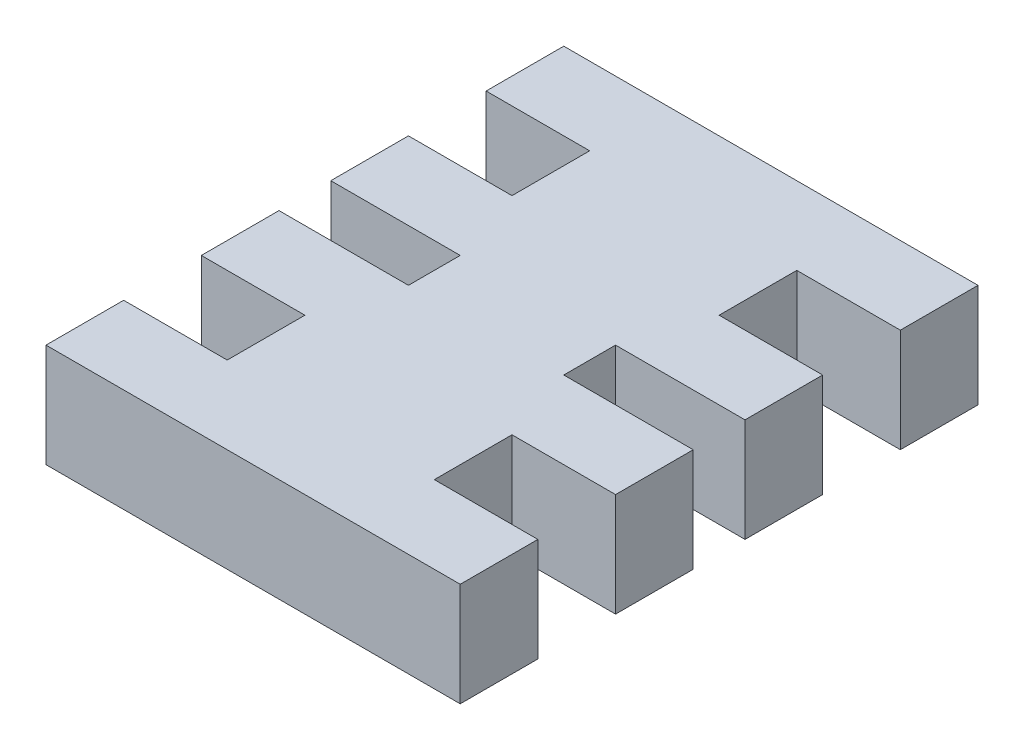
ISO-10303-21;
HEADER;
FILE_DESCRIPTION(('STEP AP214'),'2;1');
FILE_NAME('part.step','',(''),(''),'','','');
FILE_SCHEMA(('AUTOMOTIVE_DESIGN { 1 0 10303 214 1 1 1 1 }'));
ENDSEC;
DATA;
#1=APPLICATION_CONTEXT('core data for automotive mechanical design processes');
#2=APPLICATION_PROTOCOL_DEFINITION('international standard','automotive_design',2000,#1);
#3=PRODUCT_CONTEXT('',#1,'mechanical');
#4=PRODUCT('Part','Part','',(#3));
#5=PRODUCT_RELATED_PRODUCT_CATEGORY('part','',(#4));
#6=PRODUCT_DEFINITION_FORMATION('','',#4);
#7=PRODUCT_DEFINITION_CONTEXT('part definition',#1,'design');
#8=PRODUCT_DEFINITION('design','',#6,#7);
#9=PRODUCT_DEFINITION_SHAPE('','',#8);
#10=(LENGTH_UNIT() NAMED_UNIT(*) SI_UNIT(.MILLI.,.METRE.));
#11=(NAMED_UNIT(*) PLANE_ANGLE_UNIT() SI_UNIT($,.RADIAN.));
#12=(NAMED_UNIT(*) SI_UNIT($,.STERADIAN.) SOLID_ANGLE_UNIT());
#13=UNCERTAINTY_MEASURE_WITH_UNIT(LENGTH_MEASURE(1.E-05),#10,'distance_accuracy_value','');
#14=(GEOMETRIC_REPRESENTATION_CONTEXT(3) GLOBAL_UNCERTAINTY_ASSIGNED_CONTEXT((#13)) GLOBAL_UNIT_ASSIGNED_CONTEXT((#10,
#11,#12)) REPRESENTATION_CONTEXT('',''));
#15=CARTESIAN_POINT('',(0.,0.,0.));
#16=DIRECTION('',(0.,0.,1.));
#17=DIRECTION('',(1.,0.,0.));
#18=AXIS2_PLACEMENT_3D('',#15,#16,#17);
#19=CARTESIAN_POINT('',(40.,20.,-50.));
#20=DIRECTION('',(1.,0.,0.));
#21=DIRECTION('',(0.,0.,-1.));
#22=AXIS2_PLACEMENT_3D('',#19,#20,#21);
#23=PLANE('',#22);
#24=DIRECTION('',(0.,0.,1.));
#25=VECTOR('',#24,1.);
#26=CARTESIAN_POINT('',(40.,0.,-50.));
#27=LINE('',#26,#25);
#28=CARTESIAN_POINT('',(40.,0.,-50.));
#29=VERTEX_POINT('',#28);
#30=CARTESIAN_POINT('',(40.,0.,-35.));
#31=VERTEX_POINT('',#30);
#32=EDGE_CURVE('E251',#29,#31,#27,.T.);
#33=ORIENTED_EDGE('',*,*,#32,.F.);
#34=DIRECTION('',(0.,-1.,0.));
#35=VECTOR('',#34,1.);
#36=CARTESIAN_POINT('',(40.,20.,-50.));
#37=LINE('',#36,#35);
#38=CARTESIAN_POINT('',(40.,20.,-50.));
#39=VERTEX_POINT('',#38);
#40=EDGE_CURVE('E11',#39,#29,#37,.T.);
#41=ORIENTED_EDGE('',*,*,#40,.F.);
#42=DIRECTION('',(0.,0.,1.));
#43=VECTOR('',#42,1.);
#44=CARTESIAN_POINT('',(40.,20.,-50.));
#45=LINE('',#44,#43);
#46=CARTESIAN_POINT('',(40.,20.,-35.));
#47=VERTEX_POINT('',#46);
#48=EDGE_CURVE('E320',#39,#47,#45,.T.);
#49=ORIENTED_EDGE('',*,*,#48,.T.);
#50=DIRECTION('',(0.,-1.,0.));
#51=VECTOR('',#50,1.);
#52=CARTESIAN_POINT('',(40.,20.,-35.));
#53=LINE('',#52,#51);
#54=EDGE_CURVE('E36',#47,#31,#53,.T.);
#55=ORIENTED_EDGE('',*,*,#54,.T.);
#56=EDGE_LOOP('',(#33,#41,#49,#55));
#57=FACE_BOUND('',#56,.T.);
#58=ADVANCED_FACE('F33',(#57),#23,.T.);
#59=CARTESIAN_POINT('',(40.,20.,-50.));
#60=DIRECTION('',(0.,0.,1.));
#61=DIRECTION('',(1.,0.,0.));
#62=AXIS2_PLACEMENT_3D('',#59,#60,#61);
#63=PLANE('',#62);
#64=DIRECTION('',(-1.,0.,0.));
#65=VECTOR('',#64,1.);
#66=CARTESIAN_POINT('',(40.,0.,-50.));
#67=LINE('',#66,#65);
#68=CARTESIAN_POINT('',(-40.,0.,-50.));
#69=VERTEX_POINT('',#68);
#70=EDGE_CURVE('E138',#29,#69,#67,.T.);
#71=ORIENTED_EDGE('',*,*,#70,.T.);
#72=DIRECTION('',(0.,-1.,0.));
#73=VECTOR('',#72,1.);
#74=CARTESIAN_POINT('',(-40.,20.,-50.));
#75=LINE('',#74,#73);
#76=CARTESIAN_POINT('',(-40.,20.,-50.));
#77=VERTEX_POINT('',#76);
#78=EDGE_CURVE('E42',#77,#69,#75,.T.);
#79=ORIENTED_EDGE('',*,*,#78,.F.);
#80=DIRECTION('',(-1.,0.,0.));
#81=VECTOR('',#80,1.);
#82=CARTESIAN_POINT('',(40.,20.,-50.));
#83=LINE('',#82,#81);
#84=EDGE_CURVE('E229',#39,#77,#83,.T.);
#85=ORIENTED_EDGE('',*,*,#84,.F.);
#86=ORIENTED_EDGE('',*,*,#40,.T.);
#87=EDGE_LOOP('',(#71,#79,#85,#86));
#88=FACE_BOUND('',#87,.T.);
#89=ADVANCED_FACE('F548',(#88),#63,.F.);
#90=CARTESIAN_POINT('',(-40.,20.,-50.));
#91=DIRECTION('',(1.,0.,0.));
#92=DIRECTION('',(0.,0.,-1.));
#93=AXIS2_PLACEMENT_3D('',#90,#91,#92);
#94=PLANE('',#93);
#95=DIRECTION('',(0.,0.,1.));
#96=VECTOR('',#95,1.);
#97=CARTESIAN_POINT('',(-40.,0.,-50.));
#98=LINE('',#97,#96);
#99=CARTESIAN_POINT('',(-40.,0.,-35.));
#100=VERTEX_POINT('',#99);
#101=EDGE_CURVE('E236',#69,#100,#98,.T.);
#102=ORIENTED_EDGE('',*,*,#101,.T.);
#103=DIRECTION('',(0.,-1.,0.));
#104=VECTOR('',#103,1.);
#105=CARTESIAN_POINT('',(-40.,20.,-35.));
#106=LINE('',#105,#104);
#107=CARTESIAN_POINT('',(-40.,20.,-35.));
#108=VERTEX_POINT('',#107);
#109=EDGE_CURVE('E233',#108,#100,#106,.T.);
#110=ORIENTED_EDGE('',*,*,#109,.F.);
#111=DIRECTION('',(0.,0.,1.));
#112=VECTOR('',#111,1.);
#113=CARTESIAN_POINT('',(-40.,20.,-50.));
#114=LINE('',#113,#112);
#115=EDGE_CURVE('E222',#77,#108,#114,.T.);
#116=ORIENTED_EDGE('',*,*,#115,.F.);
#117=ORIENTED_EDGE('',*,*,#78,.T.);
#118=EDGE_LOOP('',(#102,#110,#116,#117));
#119=FACE_BOUND('',#118,.T.);
#120=ADVANCED_FACE('F234',(#119),#94,.F.);
#121=CARTESIAN_POINT('',(-40.,20.,-35.));
#122=DIRECTION('',(0.,0.,-1.));
#123=DIRECTION('',(-1.,0.,0.));
#124=AXIS2_PLACEMENT_3D('',#121,#122,#123);
#125=PLANE('',#124);
#126=DIRECTION('',(1.,0.,0.));
#127=VECTOR('',#126,1.);
#128=CARTESIAN_POINT('',(-40.,0.,-35.));
#129=LINE('',#128,#127);
#130=CARTESIAN_POINT('',(-20.,0.,-35.));
#131=VERTEX_POINT('',#130);
#132=EDGE_CURVE('E317',#100,#131,#129,.T.);
#133=ORIENTED_EDGE('',*,*,#132,.T.);
#134=DIRECTION('',(0.,-1.,0.));
#135=VECTOR('',#134,1.);
#136=CARTESIAN_POINT('',(-20.,20.,-35.));
#137=LINE('',#136,#135);
#138=CARTESIAN_POINT('',(-20.,20.,-35.));
#139=VERTEX_POINT('',#138);
#140=EDGE_CURVE('E239',#139,#131,#137,.T.);
#141=ORIENTED_EDGE('',*,*,#140,.F.);
#142=DIRECTION('',(1.,0.,0.));
#143=VECTOR('',#142,1.);
#144=CARTESIAN_POINT('',(-40.,20.,-35.));
#145=LINE('',#144,#143);
#146=EDGE_CURVE('E227',#108,#139,#145,.T.);
#147=ORIENTED_EDGE('',*,*,#146,.F.);
#148=ORIENTED_EDGE('',*,*,#109,.T.);
#149=EDGE_LOOP('',(#133,#141,#147,#148));
#150=FACE_BOUND('',#149,.T.);
#151=ADVANCED_FACE('F241',(#150),#125,.F.);
#152=CARTESIAN_POINT('',(-20.,20.,-35.));
#153=DIRECTION('',(1.,0.,0.));
#154=DIRECTION('',(0.,0.,-1.));
#155=AXIS2_PLACEMENT_3D('',#152,#153,#154);
#156=PLANE('',#155);
#157=DIRECTION('',(0.,0.,1.));
#158=VECTOR('',#157,1.);
#159=CARTESIAN_POINT('',(-20.,0.,-35.));
#160=LINE('',#159,#158);
#161=CARTESIAN_POINT('',(-20.,0.,-20.));
#162=VERTEX_POINT('',#161);
#163=EDGE_CURVE('E315',#131,#162,#160,.T.);
#164=ORIENTED_EDGE('',*,*,#163,.T.);
#165=DIRECTION('',(0.,-1.,0.));
#166=VECTOR('',#165,1.);
#167=CARTESIAN_POINT('',(-20.,20.,-20.));
#168=LINE('',#167,#166);
#169=CARTESIAN_POINT('',(-20.,20.,-20.));
#170=VERTEX_POINT('',#169);
#171=EDGE_CURVE('E324',#170,#162,#168,.T.);
#172=ORIENTED_EDGE('',*,*,#171,.F.);
#173=DIRECTION('',(0.,0.,1.));
#174=VECTOR('',#173,1.);
#175=CARTESIAN_POINT('',(-20.,20.,-35.));
#176=LINE('',#175,#174);
#177=EDGE_CURVE('E244',#139,#170,#176,.T.);
#178=ORIENTED_EDGE('',*,*,#177,.F.);
#179=ORIENTED_EDGE('',*,*,#140,.T.);
#180=EDGE_LOOP('',(#164,#172,#178,#179));
#181=FACE_BOUND('',#180,.T.);
#182=ADVANCED_FACE('F384',(#181),#156,.F.);
#183=CARTESIAN_POINT('',(-20.,20.,-20.));
#184=DIRECTION('',(0.,0.,1.));
#185=DIRECTION('',(1.,0.,0.));
#186=AXIS2_PLACEMENT_3D('',#183,#184,#185);
#187=PLANE('',#186);
#188=DIRECTION('',(-1.,0.,0.));
#189=VECTOR('',#188,1.);
#190=CARTESIAN_POINT('',(-20.,0.,-20.));
#191=LINE('',#190,#189);
#192=CARTESIAN_POINT('',(-40.,0.,-20.));
#193=VERTEX_POINT('',#192);
#194=EDGE_CURVE('E313',#162,#193,#191,.T.);
#195=ORIENTED_EDGE('',*,*,#194,.T.);
#196=DIRECTION('',(0.,-1.,0.));
#197=VECTOR('',#196,1.);
#198=CARTESIAN_POINT('',(-40.,20.,-20.));
#199=LINE('',#198,#197);
#200=CARTESIAN_POINT('',(-40.,20.,-20.));
#201=VERTEX_POINT('',#200);
#202=EDGE_CURVE('E327',#201,#193,#199,.T.);
#203=ORIENTED_EDGE('',*,*,#202,.F.);
#204=DIRECTION('',(-1.,0.,0.));
#205=VECTOR('',#204,1.);
#206=CARTESIAN_POINT('',(-20.,20.,-20.));
#207=LINE('',#206,#205);
#208=EDGE_CURVE('E246',#170,#201,#207,.T.);
#209=ORIENTED_EDGE('',*,*,#208,.F.);
#210=ORIENTED_EDGE('',*,*,#171,.T.);
#211=EDGE_LOOP('',(#195,#203,#209,#210));
#212=FACE_BOUND('',#211,.T.);
#213=ADVANCED_FACE('F392',(#212),#187,.F.);
#214=CARTESIAN_POINT('',(-40.,20.,-20.));
#215=DIRECTION('',(1.,0.,0.));
#216=DIRECTION('',(0.,0.,-1.));
#217=AXIS2_PLACEMENT_3D('',#214,#215,#216);
#218=PLANE('',#217);
#219=DIRECTION('',(0.,0.,1.));
#220=VECTOR('',#219,1.);
#221=CARTESIAN_POINT('',(-40.,0.,-20.));
#222=LINE('',#221,#220);
#223=CARTESIAN_POINT('',(-40.,0.,-4.99999999999999));
#224=VERTEX_POINT('',#223);
#225=EDGE_CURVE('E311',#193,#224,#222,.T.);
#226=ORIENTED_EDGE('',*,*,#225,.T.);
#227=DIRECTION('',(0.,-1.,0.));
#228=VECTOR('',#227,1.);
#229=CARTESIAN_POINT('',(-40.,20.,-4.99999999999999));
#230=LINE('',#229,#228);
#231=CARTESIAN_POINT('',(-40.,20.,-4.99999999999999));
#232=VERTEX_POINT('',#231);
#233=EDGE_CURVE('E330',#232,#224,#230,.T.);
#234=ORIENTED_EDGE('',*,*,#233,.F.);
#235=DIRECTION('',(0.,0.,1.));
#236=VECTOR('',#235,1.);
#237=CARTESIAN_POINT('',(-40.,20.,-20.));
#238=LINE('',#237,#236);
#239=EDGE_CURVE('E389',#201,#232,#238,.T.);
#240=ORIENTED_EDGE('',*,*,#239,.F.);
#241=ORIENTED_EDGE('',*,*,#202,.T.);
#242=EDGE_LOOP('',(#226,#234,#240,#241));
#243=FACE_BOUND('',#242,.T.);
#244=ADVANCED_FACE('F395',(#243),#218,.F.);
#245=CARTESIAN_POINT('',(-40.,20.,-4.99999999999999));
#246=DIRECTION('',(0.,0.,-1.));
#247=DIRECTION('',(-1.,0.,0.));
#248=AXIS2_PLACEMENT_3D('',#245,#246,#247);
#249=PLANE('',#248);
#250=DIRECTION('',(1.,0.,0.));
#251=VECTOR('',#250,1.);
#252=CARTESIAN_POINT('',(-40.,0.,-4.99999999999999));
#253=LINE('',#252,#251);
#254=CARTESIAN_POINT('',(-15.,0.,-4.99999999999999));
#255=VERTEX_POINT('',#254);
#256=EDGE_CURVE('E309',#224,#255,#253,.T.);
#257=ORIENTED_EDGE('',*,*,#256,.T.);
#258=DIRECTION('',(0.,-1.,0.));
#259=VECTOR('',#258,1.);
#260=CARTESIAN_POINT('',(-15.,20.,-4.99999999999999));
#261=LINE('',#260,#259);
#262=CARTESIAN_POINT('',(-15.,20.,-4.99999999999999));
#263=VERTEX_POINT('',#262);
#264=EDGE_CURVE('E333',#263,#255,#261,.T.);
#265=ORIENTED_EDGE('',*,*,#264,.F.);
#266=DIRECTION('',(1.,0.,0.));
#267=VECTOR('',#266,1.);
#268=CARTESIAN_POINT('',(-40.,20.,-4.99999999999999));
#269=LINE('',#268,#267);
#270=EDGE_CURVE('E397',#232,#263,#269,.T.);
#271=ORIENTED_EDGE('',*,*,#270,.F.);
#272=ORIENTED_EDGE('',*,*,#233,.T.);
#273=EDGE_LOOP('',(#257,#265,#271,#272));
#274=FACE_BOUND('',#273,.T.);
#275=ADVANCED_FACE('F537',(#274),#249,.F.);
#276=CARTESIAN_POINT('',(-15.,20.,-4.99999999999999));
#277=DIRECTION('',(1.,0.,0.));
#278=DIRECTION('',(0.,0.,-1.));
#279=AXIS2_PLACEMENT_3D('',#276,#277,#278);
#280=PLANE('',#279);
#281=DIRECTION('',(0.,0.,1.));
#282=VECTOR('',#281,1.);
#283=CARTESIAN_POINT('',(-15.,0.,-4.99999999999999));
#284=LINE('',#283,#282);
#285=CARTESIAN_POINT('',(-15.,0.,5.));
#286=VERTEX_POINT('',#285);
#287=EDGE_CURVE('E306',#255,#286,#284,.T.);
#288=ORIENTED_EDGE('',*,*,#287,.T.);
#289=DIRECTION('',(0.,-1.,0.));
#290=VECTOR('',#289,1.);
#291=CARTESIAN_POINT('',(-15.,20.,5.));
#292=LINE('',#291,#290);
#293=CARTESIAN_POINT('',(-15.,20.,5.));
#294=VERTEX_POINT('',#293);
#295=EDGE_CURVE('E336',#294,#286,#292,.T.);
#296=ORIENTED_EDGE('',*,*,#295,.F.);
#297=DIRECTION('',(0.,0.,1.));
#298=VECTOR('',#297,1.);
#299=CARTESIAN_POINT('',(-15.,20.,-4.99999999999999));
#300=LINE('',#299,#298);
#301=EDGE_CURVE('E399',#263,#294,#300,.T.);
#302=ORIENTED_EDGE('',*,*,#301,.F.);
#303=ORIENTED_EDGE('',*,*,#264,.T.);
#304=EDGE_LOOP('',(#288,#296,#302,#303));
#305=FACE_BOUND('',#304,.T.);
#306=ADVANCED_FACE('F533',(#305),#280,.F.);
#307=CARTESIAN_POINT('',(-40.,20.,5.));
#308=DIRECTION('',(0.,0.,-1.));
#309=DIRECTION('',(-1.,0.,0.));
#310=AXIS2_PLACEMENT_3D('',#307,#308,#309);
#311=PLANE('',#310);
#312=DIRECTION('',(1.,0.,0.));
#313=VECTOR('',#312,1.);
#314=CARTESIAN_POINT('',(-40.,0.,5.));
#315=LINE('',#314,#313);
#316=CARTESIAN_POINT('',(-40.,0.,5.));
#317=VERTEX_POINT('',#316);
#318=EDGE_CURVE('E303',#317,#286,#315,.T.);
#319=ORIENTED_EDGE('',*,*,#318,.F.);
#320=DIRECTION('',(0.,-1.,0.));
#321=VECTOR('',#320,1.);
#322=CARTESIAN_POINT('',(-40.,20.,5.));
#323=LINE('',#322,#321);
#324=CARTESIAN_POINT('',(-40.,20.,5.));
#325=VERTEX_POINT('',#324);
#326=EDGE_CURVE('E338',#325,#317,#323,.T.);
#327=ORIENTED_EDGE('',*,*,#326,.F.);
#328=DIRECTION('',(1.,0.,0.));
#329=VECTOR('',#328,1.);
#330=CARTESIAN_POINT('',(-40.,20.,5.));
#331=LINE('',#330,#329);
#332=EDGE_CURVE('E403',#325,#294,#331,.T.);
#333=ORIENTED_EDGE('',*,*,#332,.T.);
#334=ORIENTED_EDGE('',*,*,#295,.T.);
#335=EDGE_LOOP('',(#319,#327,#333,#334));
#336=FACE_BOUND('',#335,.T.);
#337=ADVANCED_FACE('F529',(#336),#311,.T.);
#338=CARTESIAN_POINT('',(-40.,20.,20.));
#339=DIRECTION('',(-1.,0.,0.));
#340=DIRECTION('',(0.,0.,1.));
#341=AXIS2_PLACEMENT_3D('',#338,#339,#340);
#342=PLANE('',#341);
#343=DIRECTION('',(0.,0.,-1.));
#344=VECTOR('',#343,1.);
#345=CARTESIAN_POINT('',(-40.,0.,20.));
#346=LINE('',#345,#344);
#347=CARTESIAN_POINT('',(-40.,0.,20.));
#348=VERTEX_POINT('',#347);
#349=EDGE_CURVE('E300',#348,#317,#346,.T.);
#350=ORIENTED_EDGE('',*,*,#349,.F.);
#351=DIRECTION('',(0.,-1.,0.));
#352=VECTOR('',#351,1.);
#353=CARTESIAN_POINT('',(-40.,20.,20.));
#354=LINE('',#353,#352);
#355=CARTESIAN_POINT('',(-40.,20.,20.));
#356=VERTEX_POINT('',#355);
#357=EDGE_CURVE('E340',#356,#348,#354,.T.);
#358=ORIENTED_EDGE('',*,*,#357,.F.);
#359=DIRECTION('',(0.,0.,-1.));
#360=VECTOR('',#359,1.);
#361=CARTESIAN_POINT('',(-40.,20.,20.));
#362=LINE('',#361,#360);
#363=EDGE_CURVE('E406',#356,#325,#362,.T.);
#364=ORIENTED_EDGE('',*,*,#363,.T.);
#365=ORIENTED_EDGE('',*,*,#326,.T.);
#366=EDGE_LOOP('',(#350,#358,#364,#365));
#367=FACE_BOUND('',#366,.T.);
#368=ADVANCED_FACE('F525',(#367),#342,.T.);
#369=CARTESIAN_POINT('',(-20.,20.,20.));
#370=DIRECTION('',(0.,0.,1.));
#371=DIRECTION('',(1.,0.,0.));
#372=AXIS2_PLACEMENT_3D('',#369,#370,#371);
#373=PLANE('',#372);
#374=DIRECTION('',(-1.,0.,0.));
#375=VECTOR('',#374,1.);
#376=CARTESIAN_POINT('',(-20.,0.,20.));
#377=LINE('',#376,#375);
#378=CARTESIAN_POINT('',(-20.,0.,20.));
#379=VERTEX_POINT('',#378);
#380=EDGE_CURVE('E297',#379,#348,#377,.T.);
#381=ORIENTED_EDGE('',*,*,#380,.F.);
#382=DIRECTION('',(0.,-1.,0.));
#383=VECTOR('',#382,1.);
#384=CARTESIAN_POINT('',(-20.,20.,20.));
#385=LINE('',#384,#383);
#386=CARTESIAN_POINT('',(-20.,20.,20.));
#387=VERTEX_POINT('',#386);
#388=EDGE_CURVE('E342',#387,#379,#385,.T.);
#389=ORIENTED_EDGE('',*,*,#388,.F.);
#390=DIRECTION('',(-1.,0.,0.));
#391=VECTOR('',#390,1.);
#392=CARTESIAN_POINT('',(-20.,20.,20.));
#393=LINE('',#392,#391);
#394=EDGE_CURVE('E409',#387,#356,#393,.T.);
#395=ORIENTED_EDGE('',*,*,#394,.T.);
#396=ORIENTED_EDGE('',*,*,#357,.T.);
#397=EDGE_LOOP('',(#381,#389,#395,#396));
#398=FACE_BOUND('',#397,.T.);
#399=ADVANCED_FACE('F520',(#398),#373,.T.);
#400=CARTESIAN_POINT('',(-20.,20.,35.));
#401=DIRECTION('',(-1.,0.,0.));
#402=DIRECTION('',(0.,0.,1.));
#403=AXIS2_PLACEMENT_3D('',#400,#401,#402);
#404=PLANE('',#403);
#405=DIRECTION('',(0.,0.,-1.));
#406=VECTOR('',#405,1.);
#407=CARTESIAN_POINT('',(-20.,0.,35.));
#408=LINE('',#407,#406);
#409=CARTESIAN_POINT('',(-20.,0.,35.));
#410=VERTEX_POINT('',#409);
#411=EDGE_CURVE('E294',#410,#379,#408,.T.);
#412=ORIENTED_EDGE('',*,*,#411,.F.);
#413=DIRECTION('',(0.,-1.,0.));
#414=VECTOR('',#413,1.);
#415=CARTESIAN_POINT('',(-20.,20.,35.));
#416=LINE('',#415,#414);
#417=CARTESIAN_POINT('',(-20.,20.,35.));
#418=VERTEX_POINT('',#417);
#419=EDGE_CURVE('E344',#418,#410,#416,.T.);
#420=ORIENTED_EDGE('',*,*,#419,.F.);
#421=DIRECTION('',(0.,0.,-1.));
#422=VECTOR('',#421,1.);
#423=CARTESIAN_POINT('',(-20.,20.,35.));
#424=LINE('',#423,#422);
#425=EDGE_CURVE('E412',#418,#387,#424,.T.);
#426=ORIENTED_EDGE('',*,*,#425,.T.);
#427=ORIENTED_EDGE('',*,*,#388,.T.);
#428=EDGE_LOOP('',(#412,#420,#426,#427));
#429=FACE_BOUND('',#428,.T.);
#430=ADVANCED_FACE('F516',(#429),#404,.T.);
#431=CARTESIAN_POINT('',(-40.,20.,35.));
#432=DIRECTION('',(0.,0.,-1.));
#433=DIRECTION('',(-1.,0.,0.));
#434=AXIS2_PLACEMENT_3D('',#431,#432,#433);
#435=PLANE('',#434);
#436=DIRECTION('',(1.,0.,0.));
#437=VECTOR('',#436,1.);
#438=CARTESIAN_POINT('',(-40.,0.,35.));
#439=LINE('',#438,#437);
#440=CARTESIAN_POINT('',(-40.,0.,35.));
#441=VERTEX_POINT('',#440);
#442=EDGE_CURVE('E291',#441,#410,#439,.T.);
#443=ORIENTED_EDGE('',*,*,#442,.F.);
#444=DIRECTION('',(0.,-1.,0.));
#445=VECTOR('',#444,1.);
#446=CARTESIAN_POINT('',(-40.,20.,35.));
#447=LINE('',#446,#445);
#448=CARTESIAN_POINT('',(-40.,20.,35.));
#449=VERTEX_POINT('',#448);
#450=EDGE_CURVE('E346',#449,#441,#447,.T.);
#451=ORIENTED_EDGE('',*,*,#450,.F.);
#452=DIRECTION('',(1.,0.,0.));
#453=VECTOR('',#452,1.);
#454=CARTESIAN_POINT('',(-40.,20.,35.));
#455=LINE('',#454,#453);
#456=EDGE_CURVE('E415',#449,#418,#455,.T.);
#457=ORIENTED_EDGE('',*,*,#456,.T.);
#458=ORIENTED_EDGE('',*,*,#419,.T.);
#459=EDGE_LOOP('',(#443,#451,#457,#458));
#460=FACE_BOUND('',#459,.T.);
#461=ADVANCED_FACE('F512',(#460),#435,.T.);
#462=CARTESIAN_POINT('',(-40.,20.,50.));
#463=DIRECTION('',(-1.,0.,0.));
#464=DIRECTION('',(0.,0.,1.));
#465=AXIS2_PLACEMENT_3D('',#462,#463,#464);
#466=PLANE('',#465);
#467=DIRECTION('',(0.,0.,-1.));
#468=VECTOR('',#467,1.);
#469=CARTESIAN_POINT('',(-40.,0.,50.));
#470=LINE('',#469,#468);
#471=CARTESIAN_POINT('',(-40.,0.,50.));
#472=VERTEX_POINT('',#471);
#473=EDGE_CURVE('E288',#472,#441,#470,.T.);
#474=ORIENTED_EDGE('',*,*,#473,.F.);
#475=DIRECTION('',(0.,-1.,0.));
#476=VECTOR('',#475,1.);
#477=CARTESIAN_POINT('',(-40.,20.,50.));
#478=LINE('',#477,#476);
#479=CARTESIAN_POINT('',(-40.,20.,50.));
#480=VERTEX_POINT('',#479);
#481=EDGE_CURVE('E348',#480,#472,#478,.T.);
#482=ORIENTED_EDGE('',*,*,#481,.F.);
#483=DIRECTION('',(0.,0.,-1.));
#484=VECTOR('',#483,1.);
#485=CARTESIAN_POINT('',(-40.,20.,50.));
#486=LINE('',#485,#484);
#487=EDGE_CURVE('E418',#480,#449,#486,.T.);
#488=ORIENTED_EDGE('',*,*,#487,.T.);
#489=ORIENTED_EDGE('',*,*,#450,.T.);
#490=EDGE_LOOP('',(#474,#482,#488,#489));
#491=FACE_BOUND('',#490,.T.);
#492=ADVANCED_FACE('F508',(#491),#466,.T.);
#493=CARTESIAN_POINT('',(40.,20.,50.));
#494=DIRECTION('',(0.,0.,1.));
#495=DIRECTION('',(1.,0.,0.));
#496=AXIS2_PLACEMENT_3D('',#493,#494,#495);
#497=PLANE('',#496);
#498=DIRECTION('',(-1.,0.,0.));
#499=VECTOR('',#498,1.);
#500=CARTESIAN_POINT('',(40.,0.,50.));
#501=LINE('',#500,#499);
#502=CARTESIAN_POINT('',(40.,0.,50.));
#503=VERTEX_POINT('',#502);
#504=EDGE_CURVE('E285',#503,#472,#501,.T.);
#505=ORIENTED_EDGE('',*,*,#504,.F.);
#506=DIRECTION('',(0.,-1.,0.));
#507=VECTOR('',#506,1.);
#508=CARTESIAN_POINT('',(40.,20.,50.));
#509=LINE('',#508,#507);
#510=CARTESIAN_POINT('',(40.,20.,50.));
#511=VERTEX_POINT('',#510);
#512=EDGE_CURVE('E350',#511,#503,#509,.T.);
#513=ORIENTED_EDGE('',*,*,#512,.F.);
#514=DIRECTION('',(-1.,0.,0.));
#515=VECTOR('',#514,1.);
#516=CARTESIAN_POINT('',(40.,20.,50.));
#517=LINE('',#516,#515);
#518=EDGE_CURVE('E421',#511,#480,#517,.T.);
#519=ORIENTED_EDGE('',*,*,#518,.T.);
#520=ORIENTED_EDGE('',*,*,#481,.T.);
#521=EDGE_LOOP('',(#505,#513,#519,#520));
#522=FACE_BOUND('',#521,.T.);
#523=ADVANCED_FACE('F502',(#522),#497,.T.);
#524=CARTESIAN_POINT('',(40.,20.,50.));
#525=DIRECTION('',(-1.,0.,0.));
#526=DIRECTION('',(0.,0.,1.));
#527=AXIS2_PLACEMENT_3D('',#524,#525,#526);
#528=PLANE('',#527);
#529=DIRECTION('',(0.,0.,-1.));
#530=VECTOR('',#529,1.);
#531=CARTESIAN_POINT('',(40.,0.,50.));
#532=LINE('',#531,#530);
#533=CARTESIAN_POINT('',(40.,0.,35.));
#534=VERTEX_POINT('',#533);
#535=EDGE_CURVE('E283',#503,#534,#532,.T.);
#536=ORIENTED_EDGE('',*,*,#535,.T.);
#537=DIRECTION('',(0.,-1.,0.));
#538=VECTOR('',#537,1.);
#539=CARTESIAN_POINT('',(40.,20.,35.));
#540=LINE('',#539,#538);
#541=CARTESIAN_POINT('',(40.,20.,35.));
#542=VERTEX_POINT('',#541);
#543=EDGE_CURVE('E352',#542,#534,#540,.T.);
#544=ORIENTED_EDGE('',*,*,#543,.F.);
#545=DIRECTION('',(0.,0.,-1.));
#546=VECTOR('',#545,1.);
#547=CARTESIAN_POINT('',(40.,20.,50.));
#548=LINE('',#547,#546);
#549=EDGE_CURVE('E424',#511,#542,#548,.T.);
#550=ORIENTED_EDGE('',*,*,#549,.F.);
#551=ORIENTED_EDGE('',*,*,#512,.T.);
#552=EDGE_LOOP('',(#536,#544,#550,#551));
#553=FACE_BOUND('',#552,.T.);
#554=ADVANCED_FACE('F538',(#553),#528,.F.);
#555=CARTESIAN_POINT('',(40.,20.,35.));
#556=DIRECTION('',(0.,0.,1.));
#557=DIRECTION('',(1.,0.,0.));
#558=AXIS2_PLACEMENT_3D('',#555,#556,#557);
#559=PLANE('',#558);
#560=DIRECTION('',(-1.,0.,0.));
#561=VECTOR('',#560,1.);
#562=CARTESIAN_POINT('',(40.,0.,35.));
#563=LINE('',#562,#561);
#564=CARTESIAN_POINT('',(20.,0.,35.));
#565=VERTEX_POINT('',#564);
#566=EDGE_CURVE('E281',#534,#565,#563,.T.);
#567=ORIENTED_EDGE('',*,*,#566,.T.);
#568=DIRECTION('',(0.,-1.,0.));
#569=VECTOR('',#568,1.);
#570=CARTESIAN_POINT('',(20.,20.,35.));
#571=LINE('',#570,#569);
#572=CARTESIAN_POINT('',(20.,20.,35.));
#573=VERTEX_POINT('',#572);
#574=EDGE_CURVE('E355',#573,#565,#571,.T.);
#575=ORIENTED_EDGE('',*,*,#574,.F.);
#576=DIRECTION('',(-1.,0.,0.));
#577=VECTOR('',#576,1.);
#578=CARTESIAN_POINT('',(40.,20.,35.));
#579=LINE('',#578,#577);
#580=EDGE_CURVE('E426',#542,#573,#579,.T.);
#581=ORIENTED_EDGE('',*,*,#580,.F.);
#582=ORIENTED_EDGE('',*,*,#543,.T.);
#583=EDGE_LOOP('',(#567,#575,#581,#582));
#584=FACE_BOUND('',#583,.T.);
#585=ADVANCED_FACE('F496',(#584),#559,.F.);
#586=CARTESIAN_POINT('',(20.,20.,35.));
#587=DIRECTION('',(-1.,0.,0.));
#588=DIRECTION('',(0.,0.,1.));
#589=AXIS2_PLACEMENT_3D('',#586,#587,#588);
#590=PLANE('',#589);
#591=DIRECTION('',(0.,0.,-1.));
#592=VECTOR('',#591,1.);
#593=CARTESIAN_POINT('',(20.,0.,35.));
#594=LINE('',#593,#592);
#595=CARTESIAN_POINT('',(20.,0.,20.));
#596=VERTEX_POINT('',#595);
#597=EDGE_CURVE('E279',#565,#596,#594,.T.);
#598=ORIENTED_EDGE('',*,*,#597,.T.);
#599=DIRECTION('',(0.,-1.,0.));
#600=VECTOR('',#599,1.);
#601=CARTESIAN_POINT('',(20.,20.,20.));
#602=LINE('',#601,#600);
#603=CARTESIAN_POINT('',(20.,20.,20.));
#604=VERTEX_POINT('',#603);
#605=EDGE_CURVE('E358',#604,#596,#602,.T.);
#606=ORIENTED_EDGE('',*,*,#605,.F.);
#607=DIRECTION('',(0.,0.,-1.));
#608=VECTOR('',#607,1.);
#609=CARTESIAN_POINT('',(20.,20.,35.));
#610=LINE('',#609,#608);
#611=EDGE_CURVE('E428',#573,#604,#610,.T.);
#612=ORIENTED_EDGE('',*,*,#611,.F.);
#613=ORIENTED_EDGE('',*,*,#574,.T.);
#614=EDGE_LOOP('',(#598,#606,#612,#613));
#615=FACE_BOUND('',#614,.T.);
#616=ADVANCED_FACE('F492',(#615),#590,.F.);
#617=CARTESIAN_POINT('',(20.,20.,20.));
#618=DIRECTION('',(0.,0.,-1.));
#619=DIRECTION('',(-1.,0.,0.));
#620=AXIS2_PLACEMENT_3D('',#617,#618,#619);
#621=PLANE('',#620);
#622=DIRECTION('',(1.,0.,0.));
#623=VECTOR('',#622,1.);
#624=CARTESIAN_POINT('',(20.,0.,20.));
#625=LINE('',#624,#623);
#626=CARTESIAN_POINT('',(40.,0.,20.));
#627=VERTEX_POINT('',#626);
#628=EDGE_CURVE('E277',#596,#627,#625,.T.);
#629=ORIENTED_EDGE('',*,*,#628,.T.);
#630=DIRECTION('',(0.,-1.,0.));
#631=VECTOR('',#630,1.);
#632=CARTESIAN_POINT('',(40.,20.,20.));
#633=LINE('',#632,#631);
#634=CARTESIAN_POINT('',(40.,20.,20.));
#635=VERTEX_POINT('',#634);
#636=EDGE_CURVE('E361',#635,#627,#633,.T.);
#637=ORIENTED_EDGE('',*,*,#636,.F.);
#638=DIRECTION('',(1.,0.,0.));
#639=VECTOR('',#638,1.);
#640=CARTESIAN_POINT('',(20.,20.,20.));
#641=LINE('',#640,#639);
#642=EDGE_CURVE('E430',#604,#635,#641,.T.);
#643=ORIENTED_EDGE('',*,*,#642,.F.);
#644=ORIENTED_EDGE('',*,*,#605,.T.);
#645=EDGE_LOOP('',(#629,#637,#643,#644));
#646=FACE_BOUND('',#645,.T.);
#647=ADVANCED_FACE('F487',(#646),#621,.F.);
#648=CARTESIAN_POINT('',(40.,20.,20.));
#649=DIRECTION('',(-1.,0.,0.));
#650=DIRECTION('',(0.,0.,1.));
#651=AXIS2_PLACEMENT_3D('',#648,#649,#650);
#652=PLANE('',#651);
#653=DIRECTION('',(0.,0.,-1.));
#654=VECTOR('',#653,1.);
#655=CARTESIAN_POINT('',(40.,0.,20.));
#656=LINE('',#655,#654);
#657=CARTESIAN_POINT('',(40.,0.,5.));
#658=VERTEX_POINT('',#657);
#659=EDGE_CURVE('E275',#627,#658,#656,.T.);
#660=ORIENTED_EDGE('',*,*,#659,.T.);
#661=DIRECTION('',(0.,-1.,0.));
#662=VECTOR('',#661,1.);
#663=CARTESIAN_POINT('',(40.,20.,5.));
#664=LINE('',#663,#662);
#665=CARTESIAN_POINT('',(40.,20.,5.));
#666=VERTEX_POINT('',#665);
#667=EDGE_CURVE('E364',#666,#658,#664,.T.);
#668=ORIENTED_EDGE('',*,*,#667,.F.);
#669=DIRECTION('',(0.,0.,-1.));
#670=VECTOR('',#669,1.);
#671=CARTESIAN_POINT('',(40.,20.,20.));
#672=LINE('',#671,#670);
#673=EDGE_CURVE('E432',#635,#666,#672,.T.);
#674=ORIENTED_EDGE('',*,*,#673,.F.);
#675=ORIENTED_EDGE('',*,*,#636,.T.);
#676=EDGE_LOOP('',(#660,#668,#674,#675));
#677=FACE_BOUND('',#676,.T.);
#678=ADVANCED_FACE('F481',(#677),#652,.F.);
#679=CARTESIAN_POINT('',(40.,20.,5.));
#680=DIRECTION('',(0.,0.,1.));
#681=DIRECTION('',(1.,0.,0.));
#682=AXIS2_PLACEMENT_3D('',#679,#680,#681);
#683=PLANE('',#682);
#684=DIRECTION('',(-1.,0.,0.));
#685=VECTOR('',#684,1.);
#686=CARTESIAN_POINT('',(40.,0.,5.));
#687=LINE('',#686,#685);
#688=CARTESIAN_POINT('',(15.,0.,5.));
#689=VERTEX_POINT('',#688);
#690=EDGE_CURVE('E272',#658,#689,#687,.T.);
#691=ORIENTED_EDGE('',*,*,#690,.T.);
#692=DIRECTION('',(0.,-1.,0.));
#693=VECTOR('',#692,1.);
#694=CARTESIAN_POINT('',(15.,20.,5.));
#695=LINE('',#694,#693);
#696=CARTESIAN_POINT('',(15.,20.,5.));
#697=VERTEX_POINT('',#696);
#698=EDGE_CURVE('E367',#697,#689,#695,.T.);
#699=ORIENTED_EDGE('',*,*,#698,.F.);
#700=DIRECTION('',(-1.,0.,0.));
#701=VECTOR('',#700,1.);
#702=CARTESIAN_POINT('',(40.,20.,5.));
#703=LINE('',#702,#701);
#704=EDGE_CURVE('E434',#666,#697,#703,.T.);
#705=ORIENTED_EDGE('',*,*,#704,.F.);
#706=ORIENTED_EDGE('',*,*,#667,.T.);
#707=EDGE_LOOP('',(#691,#699,#705,#706));
#708=FACE_BOUND('',#707,.T.);
#709=ADVANCED_FACE('F477',(#708),#683,.F.);
#710=CARTESIAN_POINT('',(15.,20.,-4.99999999999999));
#711=DIRECTION('',(1.,0.,0.));
#712=DIRECTION('',(0.,0.,-1.));
#713=AXIS2_PLACEMENT_3D('',#710,#711,#712);
#714=PLANE('',#713);
#715=DIRECTION('',(0.,0.,1.));
#716=VECTOR('',#715,1.);
#717=CARTESIAN_POINT('',(15.,0.,-4.99999999999999));
#718=LINE('',#717,#716);
#719=CARTESIAN_POINT('',(15.,0.,-4.99999999999999));
#720=VERTEX_POINT('',#719);
#721=EDGE_CURVE('E269',#720,#689,#718,.T.);
#722=ORIENTED_EDGE('',*,*,#721,.F.);
#723=DIRECTION('',(0.,-1.,0.));
#724=VECTOR('',#723,1.);
#725=CARTESIAN_POINT('',(15.,20.,-4.99999999999999));
#726=LINE('',#725,#724);
#727=CARTESIAN_POINT('',(15.,20.,-4.99999999999999));
#728=VERTEX_POINT('',#727);
#729=EDGE_CURVE('E369',#728,#720,#726,.T.);
#730=ORIENTED_EDGE('',*,*,#729,.F.);
#731=DIRECTION('',(0.,0.,1.));
#732=VECTOR('',#731,1.);
#733=CARTESIAN_POINT('',(15.,20.,-4.99999999999999));
#734=LINE('',#733,#732);
#735=EDGE_CURVE('E436',#728,#697,#734,.T.);
#736=ORIENTED_EDGE('',*,*,#735,.T.);
#737=ORIENTED_EDGE('',*,*,#698,.T.);
#738=EDGE_LOOP('',(#722,#730,#736,#737));
#739=FACE_BOUND('',#738,.T.);
#740=ADVANCED_FACE('F472',(#739),#714,.T.);
#741=CARTESIAN_POINT('',(40.,20.,-4.99999999999999));
#742=DIRECTION('',(0.,0.,1.));
#743=DIRECTION('',(1.,0.,0.));
#744=AXIS2_PLACEMENT_3D('',#741,#742,#743);
#745=PLANE('',#744);
#746=DIRECTION('',(-1.,0.,0.));
#747=VECTOR('',#746,1.);
#748=CARTESIAN_POINT('',(40.,0.,-4.99999999999999));
#749=LINE('',#748,#747);
#750=CARTESIAN_POINT('',(40.,0.,-4.99999999999999));
#751=VERTEX_POINT('',#750);
#752=EDGE_CURVE('E266',#751,#720,#749,.T.);
#753=ORIENTED_EDGE('',*,*,#752,.F.);
#754=DIRECTION('',(0.,-1.,0.));
#755=VECTOR('',#754,1.);
#756=CARTESIAN_POINT('',(40.,20.,-4.99999999999999));
#757=LINE('',#756,#755);
#758=CARTESIAN_POINT('',(40.,20.,-4.99999999999999));
#759=VERTEX_POINT('',#758);
#760=EDGE_CURVE('E371',#759,#751,#757,.T.);
#761=ORIENTED_EDGE('',*,*,#760,.F.);
#762=DIRECTION('',(-1.,0.,0.));
#763=VECTOR('',#762,1.);
#764=CARTESIAN_POINT('',(40.,20.,-4.99999999999999));
#765=LINE('',#764,#763);
#766=EDGE_CURVE('E439',#759,#728,#765,.T.);
#767=ORIENTED_EDGE('',*,*,#766,.T.);
#768=ORIENTED_EDGE('',*,*,#729,.T.);
#769=EDGE_LOOP('',(#753,#761,#767,#768));
#770=FACE_BOUND('',#769,.T.);
#771=ADVANCED_FACE('F467',(#770),#745,.T.);
#772=CARTESIAN_POINT('',(40.,20.,-20.));
#773=DIRECTION('',(1.,0.,0.));
#774=DIRECTION('',(0.,0.,-1.));
#775=AXIS2_PLACEMENT_3D('',#772,#773,#774);
#776=PLANE('',#775);
#777=DIRECTION('',(0.,0.,1.));
#778=VECTOR('',#777,1.);
#779=CARTESIAN_POINT('',(40.,0.,-20.));
#780=LINE('',#779,#778);
#781=CARTESIAN_POINT('',(40.,0.,-20.));
#782=VERTEX_POINT('',#781);
#783=EDGE_CURVE('E263',#782,#751,#780,.T.);
#784=ORIENTED_EDGE('',*,*,#783,.F.);
#785=DIRECTION('',(0.,-1.,0.));
#786=VECTOR('',#785,1.);
#787=CARTESIAN_POINT('',(40.,20.,-20.));
#788=LINE('',#787,#786);
#789=CARTESIAN_POINT('',(40.,20.,-20.));
#790=VERTEX_POINT('',#789);
#791=EDGE_CURVE('E373',#790,#782,#788,.T.);
#792=ORIENTED_EDGE('',*,*,#791,.F.);
#793=DIRECTION('',(0.,0.,1.));
#794=VECTOR('',#793,1.);
#795=CARTESIAN_POINT('',(40.,20.,-20.));
#796=LINE('',#795,#794);
#797=EDGE_CURVE('E442',#790,#759,#796,.T.);
#798=ORIENTED_EDGE('',*,*,#797,.T.);
#799=ORIENTED_EDGE('',*,*,#760,.T.);
#800=EDGE_LOOP('',(#784,#792,#798,#799));
#801=FACE_BOUND('',#800,.T.);
#802=ADVANCED_FACE('F463',(#801),#776,.T.);
#803=CARTESIAN_POINT('',(20.,20.,-20.));
#804=DIRECTION('',(0.,0.,-1.));
#805=DIRECTION('',(-1.,0.,0.));
#806=AXIS2_PLACEMENT_3D('',#803,#804,#805);
#807=PLANE('',#806);
#808=DIRECTION('',(1.,0.,0.));
#809=VECTOR('',#808,1.);
#810=CARTESIAN_POINT('',(20.,0.,-20.));
#811=LINE('',#810,#809);
#812=CARTESIAN_POINT('',(20.,0.,-20.));
#813=VERTEX_POINT('',#812);
#814=EDGE_CURVE('E260',#813,#782,#811,.T.);
#815=ORIENTED_EDGE('',*,*,#814,.F.);
#816=DIRECTION('',(0.,-1.,0.));
#817=VECTOR('',#816,1.);
#818=CARTESIAN_POINT('',(20.,20.,-20.));
#819=LINE('',#818,#817);
#820=CARTESIAN_POINT('',(20.,20.,-20.));
#821=VERTEX_POINT('',#820);
#822=EDGE_CURVE('E375',#821,#813,#819,.T.);
#823=ORIENTED_EDGE('',*,*,#822,.F.);
#824=DIRECTION('',(1.,0.,0.));
#825=VECTOR('',#824,1.);
#826=CARTESIAN_POINT('',(20.,20.,-20.));
#827=LINE('',#826,#825);
#828=EDGE_CURVE('E445',#821,#790,#827,.T.);
#829=ORIENTED_EDGE('',*,*,#828,.T.);
#830=ORIENTED_EDGE('',*,*,#791,.T.);
#831=EDGE_LOOP('',(#815,#823,#829,#830));
#832=FACE_BOUND('',#831,.T.);
#833=ADVANCED_FACE('F461',(#832),#807,.T.);
#834=CARTESIAN_POINT('',(20.,20.,-35.));
#835=DIRECTION('',(1.,0.,0.));
#836=DIRECTION('',(0.,0.,-1.));
#837=AXIS2_PLACEMENT_3D('',#834,#835,#836);
#838=PLANE('',#837);
#839=DIRECTION('',(0.,0.,1.));
#840=VECTOR('',#839,1.);
#841=CARTESIAN_POINT('',(20.,0.,-35.));
#842=LINE('',#841,#840);
#843=CARTESIAN_POINT('',(20.,0.,-35.));
#844=VERTEX_POINT('',#843);
#845=EDGE_CURVE('E257',#844,#813,#842,.T.);
#846=ORIENTED_EDGE('',*,*,#845,.F.);
#847=DIRECTION('',(0.,-1.,0.));
#848=VECTOR('',#847,1.);
#849=CARTESIAN_POINT('',(20.,20.,-35.));
#850=LINE('',#849,#848);
#851=CARTESIAN_POINT('',(20.,20.,-35.));
#852=VERTEX_POINT('',#851);
#853=EDGE_CURVE('E376',#852,#844,#850,.T.);
#854=ORIENTED_EDGE('',*,*,#853,.F.);
#855=DIRECTION('',(0.,0.,1.));
#856=VECTOR('',#855,1.);
#857=CARTESIAN_POINT('',(20.,20.,-35.));
#858=LINE('',#857,#856);
#859=EDGE_CURVE('E448',#852,#821,#858,.T.);
#860=ORIENTED_EDGE('',*,*,#859,.T.);
#861=ORIENTED_EDGE('',*,*,#822,.T.);
#862=EDGE_LOOP('',(#846,#854,#860,#861));
#863=FACE_BOUND('',#862,.T.);
#864=ADVANCED_FACE('F457',(#863),#838,.T.);
#865=CARTESIAN_POINT('',(40.,20.,-35.));
#866=DIRECTION('',(0.,0.,1.));
#867=DIRECTION('',(1.,0.,0.));
#868=AXIS2_PLACEMENT_3D('',#865,#866,#867);
#869=PLANE('',#868);
#870=DIRECTION('',(-1.,0.,0.));
#871=VECTOR('',#870,1.);
#872=CARTESIAN_POINT('',(40.,0.,-35.));
#873=LINE('',#872,#871);
#874=EDGE_CURVE('E254',#31,#844,#873,.T.);
#875=ORIENTED_EDGE('',*,*,#874,.F.);
#876=ORIENTED_EDGE('',*,*,#54,.F.);
#877=DIRECTION('',(-1.,0.,0.));
#878=VECTOR('',#877,1.);
#879=CARTESIAN_POINT('',(40.,20.,-35.));
#880=LINE('',#879,#878);
#881=EDGE_CURVE('E451',#47,#852,#880,.T.);
#882=ORIENTED_EDGE('',*,*,#881,.T.);
#883=ORIENTED_EDGE('',*,*,#853,.T.);
#884=EDGE_LOOP('',(#875,#876,#882,#883));
#885=FACE_BOUND('',#884,.T.);
#886=ADVANCED_FACE('F378',(#885),#869,.T.);
#887=CARTESIAN_POINT('',(0.,20.,0.));
#888=DIRECTION('',(0.,-1.,0.));
#889=DIRECTION('',(0.,0.,-1.));
#890=AXIS2_PLACEMENT_3D('',#887,#888,#889);
#891=PLANE('',#890);
#892=ORIENTED_EDGE('',*,*,#48,.F.);
#893=ORIENTED_EDGE('',*,*,#84,.T.);
#894=ORIENTED_EDGE('',*,*,#115,.T.);
#895=ORIENTED_EDGE('',*,*,#146,.T.);
#896=ORIENTED_EDGE('',*,*,#177,.T.);
#897=ORIENTED_EDGE('',*,*,#208,.T.);
#898=ORIENTED_EDGE('',*,*,#239,.T.);
#899=ORIENTED_EDGE('',*,*,#270,.T.);
#900=ORIENTED_EDGE('',*,*,#301,.T.);
#901=ORIENTED_EDGE('',*,*,#332,.F.);
#902=ORIENTED_EDGE('',*,*,#363,.F.);
#903=ORIENTED_EDGE('',*,*,#394,.F.);
#904=ORIENTED_EDGE('',*,*,#425,.F.);
#905=ORIENTED_EDGE('',*,*,#456,.F.);
#906=ORIENTED_EDGE('',*,*,#487,.F.);
#907=ORIENTED_EDGE('',*,*,#518,.F.);
#908=ORIENTED_EDGE('',*,*,#549,.T.);
#909=ORIENTED_EDGE('',*,*,#580,.T.);
#910=ORIENTED_EDGE('',*,*,#611,.T.);
#911=ORIENTED_EDGE('',*,*,#642,.T.);
#912=ORIENTED_EDGE('',*,*,#673,.T.);
#913=ORIENTED_EDGE('',*,*,#704,.T.);
#914=ORIENTED_EDGE('',*,*,#735,.F.);
#915=ORIENTED_EDGE('',*,*,#766,.F.);
#916=ORIENTED_EDGE('',*,*,#797,.F.);
#917=ORIENTED_EDGE('',*,*,#828,.F.);
#918=ORIENTED_EDGE('',*,*,#859,.F.);
#919=ORIENTED_EDGE('',*,*,#881,.F.);
#920=EDGE_LOOP('',(#892,#893,#894,#895,#896,#897,#898,#899,#900,#901,#902,#903,#904,#905,#906,
#907,#908,#909,#910,#911,#912,#913,#914,#915,#916,#917,#918,#919));
#921=FACE_BOUND('',#920,.T.);
#922=ADVANCED_FACE('F225',(#921),#891,.F.);
#923=CARTESIAN_POINT('',(0.,0.,0.));
#924=DIRECTION('',(0.,-1.,0.));
#925=DIRECTION('',(0.,0.,-1.));
#926=AXIS2_PLACEMENT_3D('',#923,#924,#925);
#927=PLANE('',#926);
#928=ORIENTED_EDGE('',*,*,#32,.T.);
#929=ORIENTED_EDGE('',*,*,#874,.T.);
#930=ORIENTED_EDGE('',*,*,#845,.T.);
#931=ORIENTED_EDGE('',*,*,#814,.T.);
#932=ORIENTED_EDGE('',*,*,#783,.T.);
#933=ORIENTED_EDGE('',*,*,#752,.T.);
#934=ORIENTED_EDGE('',*,*,#721,.T.);
#935=ORIENTED_EDGE('',*,*,#690,.F.);
#936=ORIENTED_EDGE('',*,*,#659,.F.);
#937=ORIENTED_EDGE('',*,*,#628,.F.);
#938=ORIENTED_EDGE('',*,*,#597,.F.);
#939=ORIENTED_EDGE('',*,*,#566,.F.);
#940=ORIENTED_EDGE('',*,*,#535,.F.);
#941=ORIENTED_EDGE('',*,*,#504,.T.);
#942=ORIENTED_EDGE('',*,*,#473,.T.);
#943=ORIENTED_EDGE('',*,*,#442,.T.);
#944=ORIENTED_EDGE('',*,*,#411,.T.);
#945=ORIENTED_EDGE('',*,*,#380,.T.);
#946=ORIENTED_EDGE('',*,*,#349,.T.);
#947=ORIENTED_EDGE('',*,*,#318,.T.);
#948=ORIENTED_EDGE('',*,*,#287,.F.);
#949=ORIENTED_EDGE('',*,*,#256,.F.);
#950=ORIENTED_EDGE('',*,*,#225,.F.);
#951=ORIENTED_EDGE('',*,*,#194,.F.);
#952=ORIENTED_EDGE('',*,*,#163,.F.);
#953=ORIENTED_EDGE('',*,*,#132,.F.);
#954=ORIENTED_EDGE('',*,*,#101,.F.);
#955=ORIENTED_EDGE('',*,*,#70,.F.);
#956=EDGE_LOOP('',(#928,#929,#930,#931,#932,#933,#934,#935,#936,#937,#938,#939,#940,#941,#942,
#943,#944,#945,#946,#947,#948,#949,#950,#951,#952,#953,#954,#955));
#957=FACE_BOUND('',#956,.T.);
#958=ADVANCED_FACE('F380',(#957),#927,.T.);
#959=CLOSED_SHELL('',(#58,#89,#120,#151,#182,#213,#244,#275,#306,#337,#368,#399,#430,#461,#492,
#523,#554,#585,#616,#647,#678,#709,#740,#771,#802,#833,#864,#886,#922,#958));
#960=MANIFOLD_SOLID_BREP('B2',#959);
#961=ADVANCED_BREP_SHAPE_REPRESENTATION('',(#18,#960),#14);
#962=SHAPE_DEFINITION_REPRESENTATION(#9,#961);
ENDSEC;
END-ISO-10303-21;
